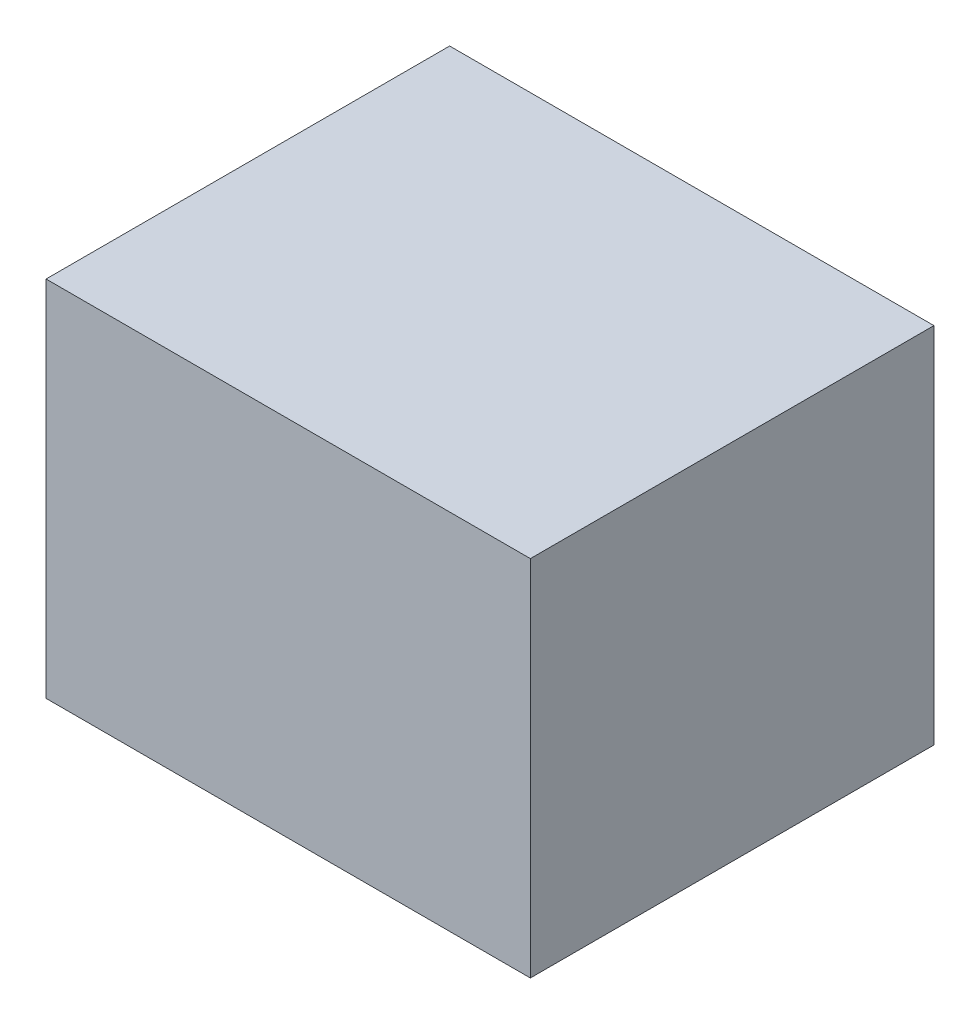
ISO-10303-21;
HEADER;
FILE_DESCRIPTION(('STEP AP214'),'2;1');
FILE_NAME('part.step','',(''),(''),'','','');
FILE_SCHEMA(('AUTOMOTIVE_DESIGN { 1 0 10303 214 1 1 1 1 }'));
ENDSEC;
DATA;
#1=APPLICATION_CONTEXT('core data for automotive mechanical design processes');
#2=APPLICATION_PROTOCOL_DEFINITION('international standard','automotive_design',2000,#1);
#3=PRODUCT_CONTEXT('',#1,'mechanical');
#4=PRODUCT('Part','Part','',(#3));
#5=PRODUCT_RELATED_PRODUCT_CATEGORY('part','',(#4));
#6=PRODUCT_DEFINITION_FORMATION('','',#4);
#7=PRODUCT_DEFINITION_CONTEXT('part definition',#1,'design');
#8=PRODUCT_DEFINITION('design','',#6,#7);
#9=PRODUCT_DEFINITION_SHAPE('','',#8);
#10=(LENGTH_UNIT() NAMED_UNIT(*) SI_UNIT(.MILLI.,.METRE.));
#11=(NAMED_UNIT(*) PLANE_ANGLE_UNIT() SI_UNIT($,.RADIAN.));
#12=(NAMED_UNIT(*) SI_UNIT($,.STERADIAN.) SOLID_ANGLE_UNIT());
#13=UNCERTAINTY_MEASURE_WITH_UNIT(LENGTH_MEASURE(1.E-05),#10,'distance_accuracy_value','');
#14=(GEOMETRIC_REPRESENTATION_CONTEXT(3) GLOBAL_UNCERTAINTY_ASSIGNED_CONTEXT((#13)) GLOBAL_UNIT_ASSIGNED_CONTEXT((#10,
#11,#12)) REPRESENTATION_CONTEXT('',''));
#15=CARTESIAN_POINT('',(0.,0.,0.));
#16=DIRECTION('',(0.,0.,1.));
#17=DIRECTION('',(1.,0.,0.));
#18=AXIS2_PLACEMENT_3D('',#15,#16,#17);
#19=CARTESIAN_POINT('',(-152.4,228.599999999999,127.));
#20=DIRECTION('',(-1.,0.,0.));
#21=DIRECTION('',(0.,0.,1.));
#22=AXIS2_PLACEMENT_3D('',#19,#20,#21);
#23=PLANE('',#22);
#24=DIRECTION('',(0.,0.,-1.));
#25=VECTOR('',#24,1.);
#26=CARTESIAN_POINT('',(-152.4,0.,127.));
#27=LINE('',#26,#25);
#28=CARTESIAN_POINT('',(-152.4,0.,127.));
#29=VERTEX_POINT('',#28);
#30=CARTESIAN_POINT('',(-152.4,0.,-127.));
#31=VERTEX_POINT('',#30);
#32=EDGE_CURVE('E98',#29,#31,#27,.T.);
#33=ORIENTED_EDGE('',*,*,#32,.F.);
#34=DIRECTION('',(0.,-1.,0.));
#35=VECTOR('',#34,1.);
#36=CARTESIAN_POINT('',(-152.4,228.599999999999,127.));
#37=LINE('',#36,#35);
#38=CARTESIAN_POINT('',(-152.4,228.599999999999,127.));
#39=VERTEX_POINT('',#38);
#40=EDGE_CURVE('E11',#39,#29,#37,.T.);
#41=ORIENTED_EDGE('',*,*,#40,.F.);
#42=DIRECTION('',(0.,0.,-1.));
#43=VECTOR('',#42,1.);
#44=CARTESIAN_POINT('',(-152.4,228.599999999999,127.));
#45=LINE('',#44,#43);
#46=CARTESIAN_POINT('',(-152.4,228.599999999999,-127.));
#47=VERTEX_POINT('',#46);
#48=EDGE_CURVE('E93',#39,#47,#45,.T.);
#49=ORIENTED_EDGE('',*,*,#48,.T.);
#50=DIRECTION('',(0.,-1.,0.));
#51=VECTOR('',#50,1.);
#52=CARTESIAN_POINT('',(-152.4,228.599999999999,-127.));
#53=LINE('',#52,#51);
#54=EDGE_CURVE('E36',#47,#31,#53,.T.);
#55=ORIENTED_EDGE('',*,*,#54,.T.);
#56=EDGE_LOOP('',(#33,#41,#49,#55));
#57=FACE_BOUND('',#56,.T.);
#58=ADVANCED_FACE('F33',(#57),#23,.T.);
#59=CARTESIAN_POINT('',(-152.4,228.599999999999,127.));
#60=DIRECTION('',(0.,0.,-1.));
#61=DIRECTION('',(-1.,0.,0.));
#62=AXIS2_PLACEMENT_3D('',#59,#60,#61);
#63=PLANE('',#62);
#64=DIRECTION('',(1.,0.,0.));
#65=VECTOR('',#64,1.);
#66=CARTESIAN_POINT('',(-152.4,0.,127.));
#67=LINE('',#66,#65);
#68=CARTESIAN_POINT('',(152.4,0.,127.));
#69=VERTEX_POINT('',#68);
#70=EDGE_CURVE('E66',#29,#69,#67,.T.);
#71=ORIENTED_EDGE('',*,*,#70,.T.);
#72=DIRECTION('',(0.,-1.,0.));
#73=VECTOR('',#72,1.);
#74=CARTESIAN_POINT('',(152.4,228.599999999999,127.));
#75=LINE('',#74,#73);
#76=CARTESIAN_POINT('',(152.4,228.599999999999,127.));
#77=VERTEX_POINT('',#76);
#78=EDGE_CURVE('E42',#77,#69,#75,.T.);
#79=ORIENTED_EDGE('',*,*,#78,.F.);
#80=DIRECTION('',(1.,0.,0.));
#81=VECTOR('',#80,1.);
#82=CARTESIAN_POINT('',(-152.4,228.599999999999,127.));
#83=LINE('',#82,#81);
#84=EDGE_CURVE('E83',#39,#77,#83,.T.);
#85=ORIENTED_EDGE('',*,*,#84,.F.);
#86=ORIENTED_EDGE('',*,*,#40,.T.);
#87=EDGE_LOOP('',(#71,#79,#85,#86));
#88=FACE_BOUND('',#87,.T.);
#89=ADVANCED_FACE('F108',(#88),#63,.F.);
#90=CARTESIAN_POINT('',(152.4,228.599999999999,127.));
#91=DIRECTION('',(-1.,0.,0.));
#92=DIRECTION('',(0.,0.,1.));
#93=AXIS2_PLACEMENT_3D('',#90,#91,#92);
#94=PLANE('',#93);
#95=DIRECTION('',(0.,0.,-1.));
#96=VECTOR('',#95,1.);
#97=CARTESIAN_POINT('',(152.4,0.,127.));
#98=LINE('',#97,#96);
#99=CARTESIAN_POINT('',(152.4,0.,-127.));
#100=VERTEX_POINT('',#99);
#101=EDGE_CURVE('E90',#69,#100,#98,.T.);
#102=ORIENTED_EDGE('',*,*,#101,.T.);
#103=DIRECTION('',(0.,-1.,0.));
#104=VECTOR('',#103,1.);
#105=CARTESIAN_POINT('',(152.4,228.599999999999,-127.));
#106=LINE('',#105,#104);
#107=CARTESIAN_POINT('',(152.4,228.599999999999,-127.));
#108=VERTEX_POINT('',#107);
#109=EDGE_CURVE('E87',#108,#100,#106,.T.);
#110=ORIENTED_EDGE('',*,*,#109,.F.);
#111=DIRECTION('',(0.,0.,-1.));
#112=VECTOR('',#111,1.);
#113=CARTESIAN_POINT('',(152.4,228.599999999999,127.));
#114=LINE('',#113,#112);
#115=EDGE_CURVE('E78',#77,#108,#114,.T.);
#116=ORIENTED_EDGE('',*,*,#115,.F.);
#117=ORIENTED_EDGE('',*,*,#78,.T.);
#118=EDGE_LOOP('',(#102,#110,#116,#117));
#119=FACE_BOUND('',#118,.T.);
#120=ADVANCED_FACE('F88',(#119),#94,.F.);
#121=CARTESIAN_POINT('',(-152.4,228.599999999999,-127.));
#122=DIRECTION('',(0.,0.,-1.));
#123=DIRECTION('',(-1.,0.,0.));
#124=AXIS2_PLACEMENT_3D('',#121,#122,#123);
#125=PLANE('',#124);
#126=DIRECTION('',(1.,0.,0.));
#127=VECTOR('',#126,1.);
#128=CARTESIAN_POINT('',(-152.4,0.,-127.));
#129=LINE('',#128,#127);
#130=EDGE_CURVE('E101',#31,#100,#129,.T.);
#131=ORIENTED_EDGE('',*,*,#130,.F.);
#132=ORIENTED_EDGE('',*,*,#54,.F.);
#133=DIRECTION('',(1.,0.,0.));
#134=VECTOR('',#133,1.);
#135=CARTESIAN_POINT('',(-152.4,228.599999999999,-127.));
#136=LINE('',#135,#134);
#137=EDGE_CURVE('E82',#47,#108,#136,.T.);
#138=ORIENTED_EDGE('',*,*,#137,.T.);
#139=ORIENTED_EDGE('',*,*,#109,.T.);
#140=EDGE_LOOP('',(#131,#132,#138,#139));
#141=FACE_BOUND('',#140,.T.);
#142=ADVANCED_FACE('F92',(#141),#125,.T.);
#143=CARTESIAN_POINT('',(0.,228.599999999999,0.));
#144=DIRECTION('',(0.,-1.,0.));
#145=DIRECTION('',(0.,0.,-1.));
#146=AXIS2_PLACEMENT_3D('',#143,#144,#145);
#147=PLANE('',#146);
#148=ORIENTED_EDGE('',*,*,#48,.F.);
#149=ORIENTED_EDGE('',*,*,#84,.T.);
#150=ORIENTED_EDGE('',*,*,#115,.T.);
#151=ORIENTED_EDGE('',*,*,#137,.F.);
#152=EDGE_LOOP('',(#148,#149,#150,#151));
#153=FACE_BOUND('',#152,.T.);
#154=ADVANCED_FACE('F81',(#153),#147,.F.);
#155=CARTESIAN_POINT('',(0.,0.,0.));
#156=DIRECTION('',(0.,-1.,0.));
#157=DIRECTION('',(0.,0.,-1.));
#158=AXIS2_PLACEMENT_3D('',#155,#156,#157);
#159=PLANE('',#158);
#160=ORIENTED_EDGE('',*,*,#32,.T.);
#161=ORIENTED_EDGE('',*,*,#130,.T.);
#162=ORIENTED_EDGE('',*,*,#101,.F.);
#163=ORIENTED_EDGE('',*,*,#70,.F.);
#164=EDGE_LOOP('',(#160,#161,#162,#163));
#165=FACE_BOUND('',#164,.T.);
#166=ADVANCED_FACE('F106',(#165),#159,.T.);
#167=CLOSED_SHELL('',(#58,#89,#120,#142,#154,#166));
#168=MANIFOLD_SOLID_BREP('B2',#167);
#169=ADVANCED_BREP_SHAPE_REPRESENTATION('',(#18,#168),#14);
#170=SHAPE_DEFINITION_REPRESENTATION(#9,#169);
ENDSEC;
END-ISO-10303-21;
